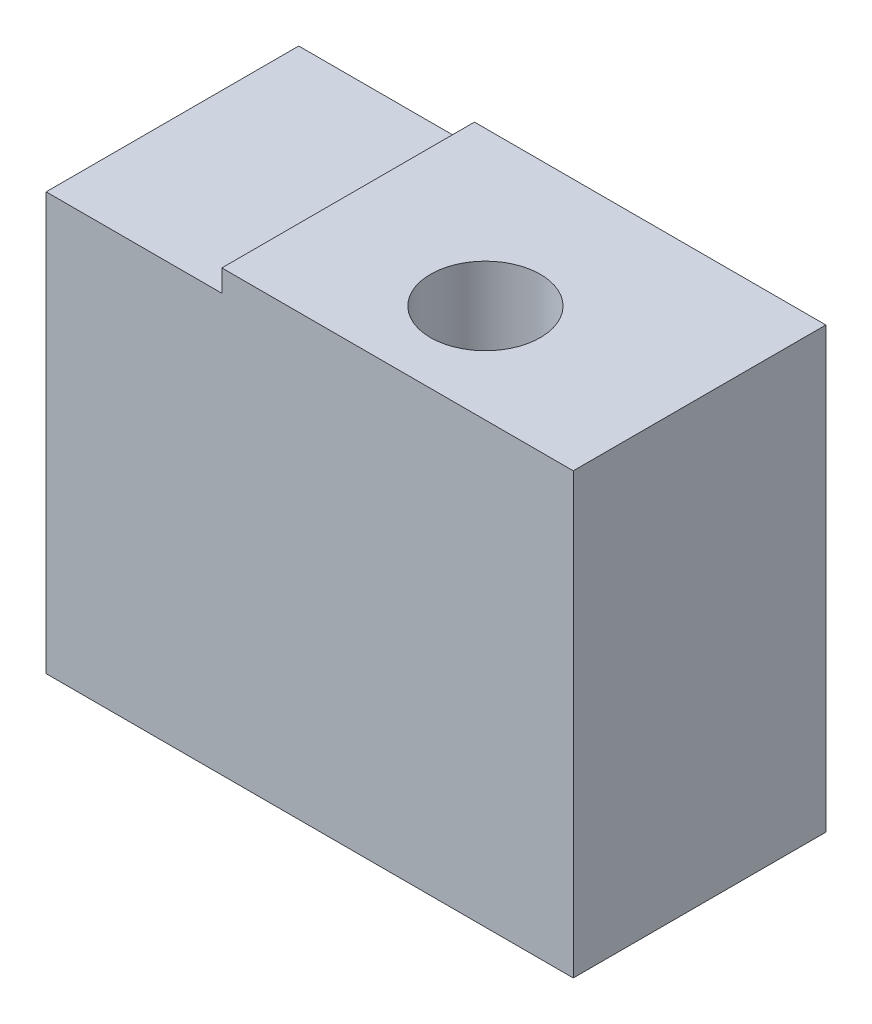
ISO-10303-21;
HEADER;
FILE_DESCRIPTION(('STEP AP214'),'2;1');
FILE_NAME('part.step','',(''),(''),'','','');
FILE_SCHEMA(('AUTOMOTIVE_DESIGN { 1 0 10303 214 1 1 1 1 }'));
ENDSEC;
DATA;
#1=APPLICATION_CONTEXT('core data for automotive mechanical design processes');
#2=APPLICATION_PROTOCOL_DEFINITION('international standard','automotive_design',2000,#1);
#3=PRODUCT_CONTEXT('',#1,'mechanical');
#4=PRODUCT('Part','Part','',(#3));
#5=PRODUCT_RELATED_PRODUCT_CATEGORY('part','',(#4));
#6=PRODUCT_DEFINITION_FORMATION('','',#4);
#7=PRODUCT_DEFINITION_CONTEXT('part definition',#1,'design');
#8=PRODUCT_DEFINITION('design','',#6,#7);
#9=PRODUCT_DEFINITION_SHAPE('','',#8);
#10=(LENGTH_UNIT() NAMED_UNIT(*) SI_UNIT(.MILLI.,.METRE.));
#11=(NAMED_UNIT(*) PLANE_ANGLE_UNIT() SI_UNIT($,.RADIAN.));
#12=(NAMED_UNIT(*) SI_UNIT($,.STERADIAN.) SOLID_ANGLE_UNIT());
#13=UNCERTAINTY_MEASURE_WITH_UNIT(LENGTH_MEASURE(1.E-05),#10,'distance_accuracy_value','');
#14=(GEOMETRIC_REPRESENTATION_CONTEXT(3) GLOBAL_UNCERTAINTY_ASSIGNED_CONTEXT((#13)) GLOBAL_UNIT_ASSIGNED_CONTEXT((#10,
#11,#12)) REPRESENTATION_CONTEXT('',''));
#15=CARTESIAN_POINT('',(0.,0.,0.));
#16=DIRECTION('',(0.,0.,1.));
#17=DIRECTION('',(1.,0.,0.));
#18=AXIS2_PLACEMENT_3D('',#15,#16,#17);
#19=CARTESIAN_POINT('',(0.,19.,11.5));
#20=DIRECTION('',(1.,0.,0.));
#21=DIRECTION('',(0.,1.,0.));
#22=AXIS2_PLACEMENT_3D('',#19,#20,#21);
#23=PLANE('',#22);
#24=DIRECTION('',(0.,-1.,0.));
#25=VECTOR('',#24,1.);
#26=CARTESIAN_POINT('',(0.,19.,0.));
#27=LINE('',#26,#25);
#28=CARTESIAN_POINT('',(0.,19.,0.));
#29=VERTEX_POINT('',#28);
#30=CARTESIAN_POINT('',(0.,0.,0.));
#31=VERTEX_POINT('',#30);
#32=EDGE_CURVE('E121',#29,#31,#27,.T.);
#33=ORIENTED_EDGE('',*,*,#32,.T.);
#34=DIRECTION('',(0.,0.,-1.));
#35=VECTOR('',#34,1.);
#36=CARTESIAN_POINT('',(0.,0.,11.5));
#37=LINE('',#36,#35);
#38=CARTESIAN_POINT('',(0.,0.,11.5));
#39=VERTEX_POINT('',#38);
#40=EDGE_CURVE('E11',#39,#31,#37,.T.);
#41=ORIENTED_EDGE('',*,*,#40,.F.);
#42=DIRECTION('',(0.,-1.,0.));
#43=VECTOR('',#42,1.);
#44=CARTESIAN_POINT('',(0.,19.,11.5));
#45=LINE('',#44,#43);
#46=CARTESIAN_POINT('',(0.,19.,11.5));
#47=VERTEX_POINT('',#46);
#48=EDGE_CURVE('E132',#47,#39,#45,.T.);
#49=ORIENTED_EDGE('',*,*,#48,.F.);
#50=DIRECTION('',(0.,0.,-1.));
#51=VECTOR('',#50,1.);
#52=CARTESIAN_POINT('',(0.,19.,11.5));
#53=LINE('',#52,#51);
#54=EDGE_CURVE('E117',#47,#29,#53,.T.);
#55=ORIENTED_EDGE('',*,*,#54,.T.);
#56=EDGE_LOOP('',(#33,#41,#49,#55));
#57=FACE_BOUND('',#56,.T.);
#58=ADVANCED_FACE('F37',(#57),#23,.F.);
#59=CARTESIAN_POINT('',(0.,0.,11.5));
#60=DIRECTION('',(0.,1.,0.));
#61=DIRECTION('',(0.,0.,1.));
#62=AXIS2_PLACEMENT_3D('',#59,#60,#61);
#63=PLANE('',#62);
#64=CARTESIAN_POINT('',(15.5,0.,7.));
#65=DIRECTION('',(0.,1.,0.));
#66=DIRECTION('',(0.,0.,1.));
#67=AXIS2_PLACEMENT_3D('',#64,#65,#66);
#68=CIRCLE('',#67,2.5);
#69=CARTESIAN_POINT('',(15.5,0.,9.49999999999999));
#70=VERTEX_POINT('',#69);
#71=EDGE_CURVE('E125',#70,#70,#68,.T.);
#72=ORIENTED_EDGE('',*,*,#71,.T.);
#73=EDGE_LOOP('',(#72));
#74=FACE_BOUND('',#73,.T.);
#75=DIRECTION('',(1.,0.,0.));
#76=VECTOR('',#75,1.);
#77=CARTESIAN_POINT('',(0.,0.,0.));
#78=LINE('',#77,#76);
#79=CARTESIAN_POINT('',(24.,0.,0.));
#80=VERTEX_POINT('',#79);
#81=EDGE_CURVE('E124',#31,#80,#78,.T.);
#82=ORIENTED_EDGE('',*,*,#81,.T.);
#83=DIRECTION('',(0.,0.,-1.));
#84=VECTOR('',#83,1.);
#85=CARTESIAN_POINT('',(24.,0.,11.5));
#86=LINE('',#85,#84);
#87=CARTESIAN_POINT('',(24.,0.,11.5));
#88=VERTEX_POINT('',#87);
#89=EDGE_CURVE('E45',#88,#80,#86,.T.);
#90=ORIENTED_EDGE('',*,*,#89,.F.);
#91=DIRECTION('',(1.,0.,0.));
#92=VECTOR('',#91,1.);
#93=CARTESIAN_POINT('',(0.,0.,11.5));
#94=LINE('',#93,#92);
#95=EDGE_CURVE('E90',#39,#88,#94,.T.);
#96=ORIENTED_EDGE('',*,*,#95,.F.);
#97=ORIENTED_EDGE('',*,*,#40,.T.);
#98=EDGE_LOOP('',(#82,#90,#96,#97));
#99=FACE_BOUND('',#98,.T.);
#100=ADVANCED_FACE('F156',(#74,#99),#63,.F.);
#101=CARTESIAN_POINT('',(24.,0.,11.5));
#102=DIRECTION('',(-1.,0.,0.));
#103=DIRECTION('',(0.,0.,1.));
#104=AXIS2_PLACEMENT_3D('',#101,#102,#103);
#105=PLANE('',#104);
#106=DIRECTION('',(0.,1.,0.));
#107=VECTOR('',#106,1.);
#108=CARTESIAN_POINT('',(24.,0.,0.));
#109=LINE('',#108,#107);
#110=CARTESIAN_POINT('',(24.,20.,0.));
#111=VERTEX_POINT('',#110);
#112=EDGE_CURVE('E127',#80,#111,#109,.T.);
#113=ORIENTED_EDGE('',*,*,#112,.T.);
#114=DIRECTION('',(0.,0.,-1.));
#115=VECTOR('',#114,1.);
#116=CARTESIAN_POINT('',(24.,20.,11.5));
#117=LINE('',#116,#115);
#118=CARTESIAN_POINT('',(24.,20.,11.5));
#119=VERTEX_POINT('',#118);
#120=EDGE_CURVE('E112',#119,#111,#117,.T.);
#121=ORIENTED_EDGE('',*,*,#120,.F.);
#122=DIRECTION('',(0.,1.,0.));
#123=VECTOR('',#122,1.);
#124=CARTESIAN_POINT('',(24.,0.,11.5));
#125=LINE('',#124,#123);
#126=EDGE_CURVE('E103',#88,#119,#125,.T.);
#127=ORIENTED_EDGE('',*,*,#126,.F.);
#128=ORIENTED_EDGE('',*,*,#89,.T.);
#129=EDGE_LOOP('',(#113,#121,#127,#128));
#130=FACE_BOUND('',#129,.T.);
#131=ADVANCED_FACE('F138',(#130),#105,.F.);
#132=CARTESIAN_POINT('',(24.,20.,11.5));
#133=DIRECTION('',(0.,-1.,0.));
#134=DIRECTION('',(1.,0.,0.));
#135=AXIS2_PLACEMENT_3D('',#132,#133,#134);
#136=PLANE('',#135);
#137=CARTESIAN_POINT('',(15.5,20.,7.));
#138=DIRECTION('',(0.,1.,0.));
#139=DIRECTION('',(0.,0.,1.));
#140=AXIS2_PLACEMENT_3D('',#137,#138,#139);
#141=CIRCLE('',#140,2.5);
#142=CARTESIAN_POINT('',(15.5,20.,9.5));
#143=VERTEX_POINT('',#142);
#144=EDGE_CURVE('E173',#143,#143,#141,.T.);
#145=ORIENTED_EDGE('',*,*,#144,.F.);
#146=EDGE_LOOP('',(#145));
#147=FACE_BOUND('',#146,.T.);
#148=DIRECTION('',(-1.,0.,0.));
#149=VECTOR('',#148,1.);
#150=CARTESIAN_POINT('',(24.,20.,0.));
#151=LINE('',#150,#149);
#152=CARTESIAN_POINT('',(8.,20.,0.));
#153=VERTEX_POINT('',#152);
#154=EDGE_CURVE('E111',#111,#153,#151,.T.);
#155=ORIENTED_EDGE('',*,*,#154,.T.);
#156=DIRECTION('',(0.,0.,-1.));
#157=VECTOR('',#156,1.);
#158=CARTESIAN_POINT('',(8.,20.,11.5));
#159=LINE('',#158,#157);
#160=CARTESIAN_POINT('',(8.,20.,11.5));
#161=VERTEX_POINT('',#160);
#162=EDGE_CURVE('E108',#161,#153,#159,.T.);
#163=ORIENTED_EDGE('',*,*,#162,.F.);
#164=DIRECTION('',(-1.,0.,0.));
#165=VECTOR('',#164,1.);
#166=CARTESIAN_POINT('',(24.,20.,11.5));
#167=LINE('',#166,#165);
#168=EDGE_CURVE('E97',#119,#161,#167,.T.);
#169=ORIENTED_EDGE('',*,*,#168,.F.);
#170=ORIENTED_EDGE('',*,*,#120,.T.);
#171=EDGE_LOOP('',(#155,#163,#169,#170));
#172=FACE_BOUND('',#171,.T.);
#173=ADVANCED_FACE('F109',(#147,#172),#136,.F.);
#174=CARTESIAN_POINT('',(8.,20.,11.5));
#175=DIRECTION('',(1.,0.,0.));
#176=DIRECTION('',(0.,0.,-1.));
#177=AXIS2_PLACEMENT_3D('',#174,#175,#176);
#178=PLANE('',#177);
#179=DIRECTION('',(0.,-1.,0.));
#180=VECTOR('',#179,1.);
#181=CARTESIAN_POINT('',(8.,20.,0.));
#182=LINE('',#181,#180);
#183=CARTESIAN_POINT('',(8.,19.,0.));
#184=VERTEX_POINT('',#183);
#185=EDGE_CURVE('E76',#153,#184,#182,.T.);
#186=ORIENTED_EDGE('',*,*,#185,.T.);
#187=DIRECTION('',(0.,0.,-1.));
#188=VECTOR('',#187,1.);
#189=CARTESIAN_POINT('',(8.,19.,11.5));
#190=LINE('',#189,#188);
#191=CARTESIAN_POINT('',(8.,19.,11.5));
#192=VERTEX_POINT('',#191);
#193=EDGE_CURVE('E113',#192,#184,#190,.T.);
#194=ORIENTED_EDGE('',*,*,#193,.F.);
#195=DIRECTION('',(0.,-1.,0.));
#196=VECTOR('',#195,1.);
#197=CARTESIAN_POINT('',(8.,20.,11.5));
#198=LINE('',#197,#196);
#199=EDGE_CURVE('E101',#161,#192,#198,.T.);
#200=ORIENTED_EDGE('',*,*,#199,.F.);
#201=ORIENTED_EDGE('',*,*,#162,.T.);
#202=EDGE_LOOP('',(#186,#194,#200,#201));
#203=FACE_BOUND('',#202,.T.);
#204=ADVANCED_FACE('F115',(#203),#178,.F.);
#205=CARTESIAN_POINT('',(8.,19.,11.5));
#206=DIRECTION('',(0.,-1.,0.));
#207=DIRECTION('',(0.,0.,-1.));
#208=AXIS2_PLACEMENT_3D('',#205,#206,#207);
#209=PLANE('',#208);
#210=DIRECTION('',(-1.,0.,0.));
#211=VECTOR('',#210,1.);
#212=CARTESIAN_POINT('',(8.,19.,0.));
#213=LINE('',#212,#211);
#214=EDGE_CURVE('E82',#184,#29,#213,.T.);
#215=ORIENTED_EDGE('',*,*,#214,.T.);
#216=ORIENTED_EDGE('',*,*,#54,.F.);
#217=DIRECTION('',(-1.,0.,0.));
#218=VECTOR('',#217,1.);
#219=CARTESIAN_POINT('',(8.,19.,11.5));
#220=LINE('',#219,#218);
#221=EDGE_CURVE('E53',#192,#47,#220,.T.);
#222=ORIENTED_EDGE('',*,*,#221,.F.);
#223=ORIENTED_EDGE('',*,*,#193,.T.);
#224=EDGE_LOOP('',(#215,#216,#222,#223));
#225=FACE_BOUND('',#224,.T.);
#226=ADVANCED_FACE('F145',(#225),#209,.F.);
#227=CARTESIAN_POINT('',(0.,0.,11.5));
#228=DIRECTION('',(0.,0.,1.));
#229=DIRECTION('',(1.,0.,0.));
#230=AXIS2_PLACEMENT_3D('',#227,#228,#229);
#231=PLANE('',#230);
#232=ORIENTED_EDGE('',*,*,#48,.T.);
#233=ORIENTED_EDGE('',*,*,#95,.T.);
#234=ORIENTED_EDGE('',*,*,#126,.T.);
#235=ORIENTED_EDGE('',*,*,#168,.T.);
#236=ORIENTED_EDGE('',*,*,#199,.T.);
#237=ORIENTED_EDGE('',*,*,#221,.T.);
#238=EDGE_LOOP('',(#232,#233,#234,#235,#236,#237));
#239=FACE_BOUND('',#238,.T.);
#240=ADVANCED_FACE('F99',(#239),#231,.T.);
#241=CARTESIAN_POINT('',(0.,0.,0.));
#242=DIRECTION('',(0.,0.,1.));
#243=DIRECTION('',(1.,0.,0.));
#244=AXIS2_PLACEMENT_3D('',#241,#242,#243);
#245=PLANE('',#244);
#246=ORIENTED_EDGE('',*,*,#32,.F.);
#247=ORIENTED_EDGE('',*,*,#214,.F.);
#248=ORIENTED_EDGE('',*,*,#185,.F.);
#249=ORIENTED_EDGE('',*,*,#154,.F.);
#250=ORIENTED_EDGE('',*,*,#112,.F.);
#251=ORIENTED_EDGE('',*,*,#81,.F.);
#252=EDGE_LOOP('',(#246,#247,#248,#249,#250,#251));
#253=FACE_BOUND('',#252,.T.);
#254=ADVANCED_FACE('F141',(#253),#245,.F.);
#255=CARTESIAN_POINT('',(15.5,20.,7.));
#256=DIRECTION('',(0.,1.,0.));
#257=DIRECTION('',(0.,0.,1.));
#258=AXIS2_PLACEMENT_3D('',#255,#256,#257);
#259=CYLINDRICAL_SURFACE('',#258,2.5);
#260=ORIENTED_EDGE('',*,*,#71,.F.);
#261=EDGE_LOOP('',(#260));
#262=FACE_BOUND('',#261,.T.);
#263=ORIENTED_EDGE('',*,*,#144,.T.);
#264=EDGE_LOOP('',(#263));
#265=FACE_BOUND('',#264,.T.);
#266=ADVANCED_FACE('F181',(#262,#265),#259,.F.);
#267=CLOSED_SHELL('',(#58,#100,#131,#173,#204,#226,#240,#254,#266));
#268=MANIFOLD_SOLID_BREP('B2',#267);
#269=ADVANCED_BREP_SHAPE_REPRESENTATION('',(#18,#268),#14);
#270=SHAPE_DEFINITION_REPRESENTATION(#9,#269);
ENDSEC;
END-ISO-10303-21;
